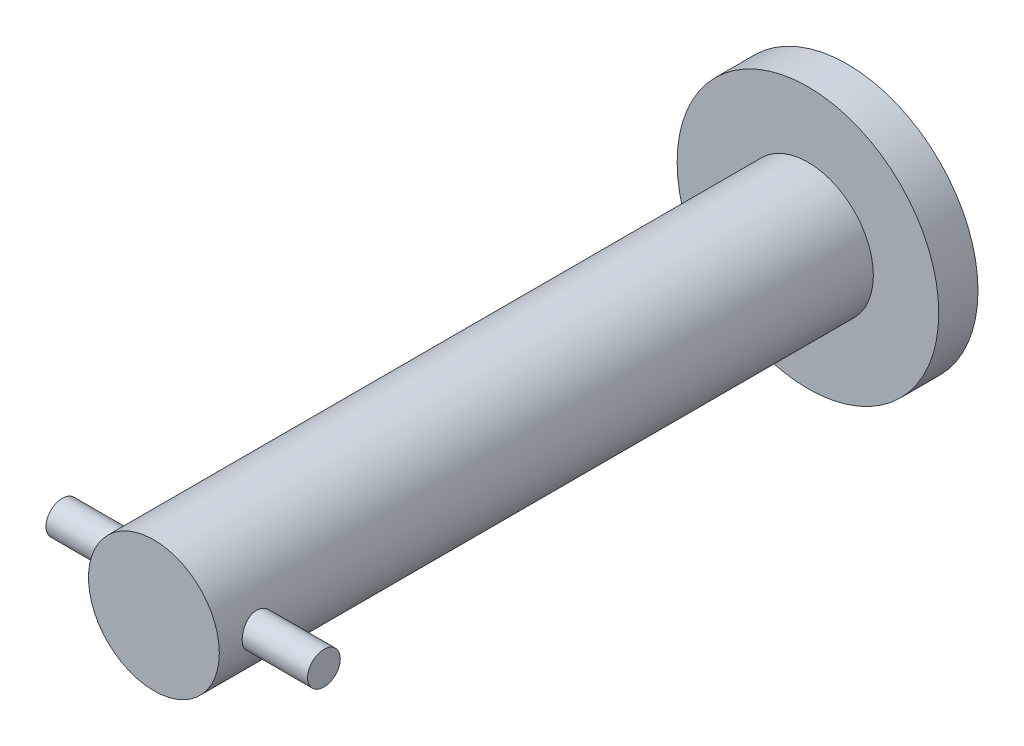
ISO-10303-21;
HEADER;
FILE_DESCRIPTION(('STEP AP214'),'2;1');
FILE_NAME('part.step','',(''),(''),'','','');
FILE_SCHEMA(('AUTOMOTIVE_DESIGN { 1 0 10303 214 1 1 1 1 }'));
ENDSEC;
DATA;
#1=APPLICATION_CONTEXT('core data for automotive mechanical design processes');
#2=APPLICATION_PROTOCOL_DEFINITION('international standard','automotive_design',2000,#1);
#3=PRODUCT_CONTEXT('',#1,'mechanical');
#4=PRODUCT('Part','Part','',(#3));
#5=PRODUCT_RELATED_PRODUCT_CATEGORY('part','',(#4));
#6=PRODUCT_DEFINITION_FORMATION('','',#4);
#7=PRODUCT_DEFINITION_CONTEXT('part definition',#1,'design');
#8=PRODUCT_DEFINITION('design','',#6,#7);
#9=PRODUCT_DEFINITION_SHAPE('','',#8);
#10=(LENGTH_UNIT() NAMED_UNIT(*) SI_UNIT(.MILLI.,.METRE.));
#11=(NAMED_UNIT(*) PLANE_ANGLE_UNIT() SI_UNIT($,.RADIAN.));
#12=(NAMED_UNIT(*) SI_UNIT($,.STERADIAN.) SOLID_ANGLE_UNIT());
#13=UNCERTAINTY_MEASURE_WITH_UNIT(LENGTH_MEASURE(1.E-05),#10,'distance_accuracy_value','');
#14=(GEOMETRIC_REPRESENTATION_CONTEXT(3) GLOBAL_UNCERTAINTY_ASSIGNED_CONTEXT((#13)) GLOBAL_UNIT_ASSIGNED_CONTEXT((#10,
#11,#12)) REPRESENTATION_CONTEXT('',''));
#15=CARTESIAN_POINT('',(0.,0.,0.));
#16=DIRECTION('',(0.,0.,1.));
#17=DIRECTION('',(1.,0.,0.));
#18=AXIS2_PLACEMENT_3D('',#15,#16,#17);
#19=CARTESIAN_POINT('',(0.,0.,5.));
#20=DIRECTION('',(0.,0.,1.));
#21=DIRECTION('',(1.,0.,0.));
#22=AXIS2_PLACEMENT_3D('',#19,#20,#21);
#23=PLANE('',#22);
#24=CARTESIAN_POINT('',(0.,0.,5.));
#25=DIRECTION('',(0.,0.,1.));
#26=DIRECTION('',(1.,0.,0.));
#27=AXIS2_PLACEMENT_3D('',#24,#25,#26);
#28=CIRCLE('',#27,10.);
#29=CARTESIAN_POINT('',(10.,0.,5.));
#30=VERTEX_POINT('',#29);
#31=EDGE_CURVE('E56',#30,#30,#28,.T.);
#32=ORIENTED_EDGE('',*,*,#31,.T.);
#33=EDGE_LOOP('',(#32));
#34=FACE_BOUND('',#33,.T.);
#35=CARTESIAN_POINT('',(0.,0.,5.));
#36=DIRECTION('',(0.,0.,1.));
#37=DIRECTION('',(1.,0.,0.));
#38=AXIS2_PLACEMENT_3D('',#35,#36,#37);
#39=CIRCLE('',#38,5.);
#40=CARTESIAN_POINT('',(5.,0.,5.));
#41=VERTEX_POINT('',#40);
#42=EDGE_CURVE('E108',#41,#41,#39,.T.);
#43=ORIENTED_EDGE('',*,*,#42,.F.);
#44=EDGE_LOOP('',(#43));
#45=FACE_BOUND('',#44,.T.);
#46=ADVANCED_FACE('F37',(#34,#45),#23,.T.);
#47=CARTESIAN_POINT('',(0.,0.,0.));
#48=DIRECTION('',(0.,0.,1.));
#49=DIRECTION('',(1.,0.,0.));
#50=AXIS2_PLACEMENT_3D('',#47,#48,#49);
#51=PLANE('',#50);
#52=CARTESIAN_POINT('',(0.,0.,0.));
#53=DIRECTION('',(0.,0.,1.));
#54=DIRECTION('',(1.,0.,0.));
#55=AXIS2_PLACEMENT_3D('',#52,#53,#54);
#56=CIRCLE('',#55,6.99999999999999);
#57=CARTESIAN_POINT('',(6.99999999999999,0.,0.));
#58=VERTEX_POINT('',#57);
#59=EDGE_CURVE('E10',#58,#58,#56,.F.);
#60=ORIENTED_EDGE('',*,*,#59,.T.);
#61=EDGE_LOOP('',(#60));
#62=FACE_BOUND('',#61,.T.);
#63=ADVANCED_FACE('F92',(#62),#51,.F.);
#64=CARTESIAN_POINT('',(0.,0.,5.));
#65=DIRECTION('',(0.,0.,-1.));
#66=DIRECTION('',(-1.,0.,0.));
#67=AXIS2_PLACEMENT_3D('',#64,#65,#66);
#68=CYLINDRICAL_SURFACE('',#67,10.);
#69=CARTESIAN_POINT('',(0.,0.,2.00000000000001));
#70=DIRECTION('',(0.,0.,1.));
#71=DIRECTION('',(1.,0.,0.));
#72=AXIS2_PLACEMENT_3D('',#69,#70,#71);
#73=CIRCLE('',#72,10.);
#74=CARTESIAN_POINT('',(10.,0.,2.00000000000001));
#75=VERTEX_POINT('',#74);
#76=EDGE_CURVE('E53',#75,#75,#73,.T.);
#77=ORIENTED_EDGE('',*,*,#76,.T.);
#78=EDGE_LOOP('',(#77));
#79=FACE_BOUND('',#78,.T.);
#80=ORIENTED_EDGE('',*,*,#31,.F.);
#81=EDGE_LOOP('',(#80));
#82=FACE_BOUND('',#81,.T.);
#83=ADVANCED_FACE('F95',(#79,#82),#68,.T.);
#84=CARTESIAN_POINT('',(0.,0.,55.));
#85=DIRECTION('',(0.,0.,-1.));
#86=DIRECTION('',(-1.,0.,0.));
#87=AXIS2_PLACEMENT_3D('',#84,#85,#86);
#88=CYLINDRICAL_SURFACE('',#87,5.);
#89=CARTESIAN_POINT('',(-5.,0.,53.25));
#90=CARTESIAN_POINT('',(-4.99999883223344,-0.0690634072247758,53.2499980618849));
#91=CARTESIAN_POINT('',(-4.99855481776523,-0.138148464858969,53.2442570410218));
#92=CARTESIAN_POINT('',(-4.99293428191577,-0.27433860314211,53.2214790405775));
#93=CARTESIAN_POINT('',(-4.98875621183307,-0.341442539058949,53.2044356587185));
#94=CARTESIAN_POINT('',(-4.97813021943366,-0.471684060152147,53.1596339554483));
#95=CARTESIAN_POINT('',(-4.97168502368406,-0.534826302858336,53.1318885010706));
#96=CARTESIAN_POINT('',(-4.95721119839661,-0.655560109920356,53.066515508296));
#97=CARTESIAN_POINT('',(-4.94918251545042,-0.7131514869573,53.0288876365676));
#98=CARTESIAN_POINT('',(-4.93222844659834,-0.822334939417434,52.9439993419548));
#99=CARTESIAN_POINT('',(-4.92328922623777,-0.873796408384228,52.896573687534));
#100=CARTESIAN_POINT('',(-4.90561350097941,-0.968124106002755,52.7937898292426));
#101=CARTESIAN_POINT('',(-4.89687701906957,-1.01098936412428,52.7384307308779));
#102=CARTESIAN_POINT('',(-4.88045646416425,-1.08752211899919,52.6203373110521));
#103=CARTESIAN_POINT('',(-4.87278995392171,-1.12104351327113,52.5575056409913));
#104=CARTESIAN_POINT('',(-4.85957912343519,-1.17699742379211,52.426876323618));
#105=CARTESIAN_POINT('',(-4.8540344639399,-1.19943171286611,52.3590794722285));
#106=CARTESIAN_POINT('',(-4.84583730597959,-1.23212903067024,52.2218804181646));
#107=CARTESIAN_POINT('',(-4.84312909229521,-1.24262689027779,52.1525375866252));
#108=CARTESIAN_POINT('',(-4.8407446878145,-1.25188481255655,52.0130261924884));
#109=CARTESIAN_POINT('',(-4.8410680037387,-1.25064678484832,51.9428577660845));
#110=CARTESIAN_POINT('',(-4.84466004580515,-1.23665543719941,51.8054868268796));
#111=CARTESIAN_POINT('',(-4.84785719168232,-1.22418195015877,51.7382536487791));
#112=CARTESIAN_POINT('',(-4.85672258063736,-1.1885201557526,51.6068657909073));
#113=CARTESIAN_POINT('',(-4.8623909997558,-1.16533108505786,51.5427113308092));
#114=CARTESIAN_POINT('',(-4.87562594920155,-1.10865789828097,51.4185516531233));
#115=CARTESIAN_POINT('',(-4.88321106224517,-1.0750722226941,51.358594856842));
#116=CARTESIAN_POINT('',(-4.89941425705321,-0.998630230012472,51.2450677418693));
#117=CARTESIAN_POINT('',(-4.90803251945612,-0.955772290674044,51.1914985432773));
#118=CARTESIAN_POINT('',(-4.92563233783151,-0.860552853901028,51.090663653588));
#119=CARTESIAN_POINT('',(-4.93461724564976,-0.80795521513823,51.0436212582822));
#120=CARTESIAN_POINT('',(-4.95171637982321,-0.695509931253097,50.9589822979467));
#121=CARTESIAN_POINT('',(-4.95983057957846,-0.635662064756634,50.921386021447));
#122=CARTESIAN_POINT('',(-4.97431443411818,-0.510096573901175,50.8566245114797));
#123=CARTESIAN_POINT('',(-4.98067800106437,-0.444359494340535,50.829495549788));
#124=CARTESIAN_POINT('',(-4.99089930826182,-0.309063340119084,50.7867355785754));
#125=CARTESIAN_POINT('',(-4.99475752782734,-0.239504999292086,50.7711023696516));
#126=CARTESIAN_POINT('',(-4.99946249392812,-0.100449975325038,50.7521186953676));
#127=CARTESIAN_POINT('',(-5.00038377923565,-0.0309972666568571,50.7484641449373));
#128=CARTESIAN_POINT('',(-4.99932337345376,0.107527395667908,50.7527075017129));
#129=CARTESIAN_POINT('',(-4.99734194368205,0.176599383037147,50.7606043689993));
#130=CARTESIAN_POINT('',(-4.99074650939464,0.311345223980395,50.7874757569928));
#131=CARTESIAN_POINT('',(-4.98617195154843,0.377054265807281,50.8062843862308));
#132=CARTESIAN_POINT('',(-4.97490588861778,0.504381077043745,50.854255903357));
#133=CARTESIAN_POINT('',(-4.9682141697491,0.56599843252718,50.8834198369276));
#134=CARTESIAN_POINT('',(-4.95327756605259,0.684602612024857,50.9518634407289));
#135=CARTESIAN_POINT('',(-4.94500722805777,0.74148786819651,50.9913134269973));
#136=CARTESIAN_POINT('',(-4.92787090989516,0.847938844702688,51.0789915906641));
#137=CARTESIAN_POINT('',(-4.91900482709754,0.897503299144155,51.1272212830141));
#138=CARTESIAN_POINT('',(-4.9014079746731,0.989158806727259,51.232501634037));
#139=CARTESIAN_POINT('',(-4.89268586822734,1.03103655635168,51.289739752502));
#140=CARTESIAN_POINT('',(-4.87660731981032,1.10459229917723,51.4106105287214));
#141=CARTESIAN_POINT('',(-4.86925081722522,1.1362707451316,51.4742429024665));
#142=CARTESIAN_POINT('',(-4.85681745612221,1.18829285050773,51.6057547686776));
#143=CARTESIAN_POINT('',(-4.85172712743255,1.20870366387837,51.6736063569533));
#144=CARTESIAN_POINT('',(-4.84438953408486,1.23778804996147,51.8119246982409));
#145=CARTESIAN_POINT('',(-4.84214164766614,1.24646418956554,51.8823908758604));
#146=CARTESIAN_POINT('',(-4.84079084336631,1.25169882527832,52.0217675198793));
#147=CARTESIAN_POINT('',(-4.8415994394022,1.24859824815009,52.0906645292706));
#148=CARTESIAN_POINT('',(-4.84606590839869,1.23114773192738,52.2269199072233));
#149=CARTESIAN_POINT('',(-4.84972372409881,1.21679801890563,52.294278306678));
#150=CARTESIAN_POINT('',(-4.85942717235602,1.17744276620232,52.4251737158878));
#151=CARTESIAN_POINT('',(-4.86545846030258,1.15250117056697,52.4887310877002));
#152=CARTESIAN_POINT('',(-4.87923129770691,1.09272076133755,52.6108044855947));
#153=CARTESIAN_POINT('',(-4.88697308433978,1.05788057502848,52.6693198109891));
#154=CARTESIAN_POINT('',(-4.90354695219593,0.978223123864275,52.7812955241683));
#155=CARTESIAN_POINT('',(-4.91240220693131,0.933169302426872,52.8345842278533));
#156=CARTESIAN_POINT('',(-4.93006689371905,0.83482447599144,52.9329558706628));
#157=CARTESIAN_POINT('',(-4.93887631439216,0.781531517717616,52.9780368584275));
#158=CARTESIAN_POINT('',(-4.95564713039719,0.667056322252154,53.0595094238038));
#159=CARTESIAN_POINT('',(-4.9635902780489,0.605748685263651,53.0957288447263));
#160=CARTESIAN_POINT('',(-4.97754104145932,0.477721716258728,53.1572895524504));
#161=CARTESIAN_POINT('',(-4.98355004333151,0.411006302863949,53.1826386338738));
#162=CARTESIAN_POINT('',(-4.99206716304618,0.28700854436956,53.2179765252747));
#163=CARTESIAN_POINT('',(-4.99502154210575,0.230316809090057,53.2299593692112));
#164=CARTESIAN_POINT('',(-4.9989883769329,0.115755059613569,53.2459716196849));
#165=CARTESIAN_POINT('',(-5.00000097875745,0.0578851343688469,53.2500016244211));
#166=CARTESIAN_POINT('',(-5.,0.,53.25));
#167=B_SPLINE_CURVE_WITH_KNOTS('',3,(#89,#90,#91,#92,#93,#94,#95,#96,#97,#98,#99,#100,#101,#102,
#103,#104,#105,#106,#107,#108,#109,#110,#111,#112,#113,#114,#115,#116,#117,#118,#119,#120,#121,
#122,#123,#124,#125,#126,#127,#128,#129,#130,#131,#132,#133,#134,#135,#136,#137,#138,#139,#140,
#141,#142,#143,#144,#145,#146,#147,#148,#149,#150,#151,#152,#153,#154,#155,#156,#157,#158,#159,
#160,#161,#162,#163,#164,#165,#166),.UNSPECIFIED.,.T.,.F.,(4,2,2,2,2,2,2,2,2,2,2,2,2,2,2,2,2,2,
2,2,2,2,2,2,2,2,2,2,2,2,2,2,2,2,2,2,2,2,4),(0.,0.206978093726575,0.414073531469914,
0.620920751905089,0.827774950141104,1.03845362864283,1.24915607983385,1.46298872954838,
1.67678717641139,1.88630245916191,2.09578365093913,2.30018747505847,2.50460586221698,
2.71108773228232,2.91760575696801,3.13001250807515,3.34242574631871,3.55556857507594,
3.76867061407201,3.97631924124396,4.18394917593951,4.38850228761697,4.59307606101907,
4.80127989637792,5.00951969173347,5.22287091003728,5.43621265624588,5.64826878845028,
5.86027852710338,6.06619816998843,6.2721136746336,6.47680333799538,6.68152140114082,
6.8915798034159,7.10168808142013,7.31560154582987,7.52936136517789,7.70285202451788,
7.87632963369197),.UNSPECIFIED.);
#168=CARTESIAN_POINT('',(-5.,0.,53.25));
#169=VERTEX_POINT('',#168);
#170=EDGE_CURVE('E44',#169,#169,#167,.T.);
#171=ORIENTED_EDGE('',*,*,#170,.T.);
#172=EDGE_LOOP('',(#171));
#173=FACE_BOUND('',#172,.T.);
#174=CARTESIAN_POINT('',(5.,0.,50.75));
#175=CARTESIAN_POINT('',(4.99999883223344,-0.0690634072247831,50.7500019381151));
#176=CARTESIAN_POINT('',(4.99855481776523,-0.138148464858976,50.7557429589782));
#177=CARTESIAN_POINT('',(4.99293428191577,-0.274338603142117,50.7785209594225));
#178=CARTESIAN_POINT('',(4.98875621183307,-0.341442539058956,50.7955643412815));
#179=CARTESIAN_POINT('',(4.97813021943366,-0.471684060152155,50.8403660445517));
#180=CARTESIAN_POINT('',(4.97168502368405,-0.534826302858343,50.8681114989294));
#181=CARTESIAN_POINT('',(4.95721119839661,-0.655560109920362,50.933484491704));
#182=CARTESIAN_POINT('',(4.94918251545042,-0.713151486957304,50.9711123634324));
#183=CARTESIAN_POINT('',(4.93222844659834,-0.822334939417438,51.0560006580452));
#184=CARTESIAN_POINT('',(4.92328922623777,-0.873796408384232,51.103426312466));
#185=CARTESIAN_POINT('',(4.90561350097941,-0.968124106002759,51.2062101707574));
#186=CARTESIAN_POINT('',(4.89687701906957,-1.01098936412428,51.2615692691221));
#187=CARTESIAN_POINT('',(4.88045646416425,-1.0875221189992,51.3796626889479));
#188=CARTESIAN_POINT('',(4.87278995392171,-1.12104351327113,51.4424943590087));
#189=CARTESIAN_POINT('',(4.85957912343519,-1.17699742379211,51.573123676382));
#190=CARTESIAN_POINT('',(4.8540344639399,-1.19943171286611,51.6409205277715));
#191=CARTESIAN_POINT('',(4.84583730597959,-1.23212903067025,51.7781195818354));
#192=CARTESIAN_POINT('',(4.84312909229521,-1.24262689027779,51.8474624133748));
#193=CARTESIAN_POINT('',(4.8407446878145,-1.25188481255655,51.9869738075116));
#194=CARTESIAN_POINT('',(4.8410680037387,-1.25064678484832,52.0571422339155));
#195=CARTESIAN_POINT('',(4.84466004580515,-1.23665543719941,52.1945131731204));
#196=CARTESIAN_POINT('',(4.84785719168233,-1.22418195015877,52.2617463512209));
#197=CARTESIAN_POINT('',(4.85672258063736,-1.18852015575259,52.3931342090927));
#198=CARTESIAN_POINT('',(4.8623909997558,-1.16533108505786,52.4572886691908));
#199=CARTESIAN_POINT('',(4.87562594920155,-1.10865789828096,52.5814483468767));
#200=CARTESIAN_POINT('',(4.88321106224517,-1.0750722226941,52.641405143158));
#201=CARTESIAN_POINT('',(4.89941425705321,-0.998630230012469,52.7549322581307));
#202=CARTESIAN_POINT('',(4.90803251945612,-0.95577229067404,52.8085014567227));
#203=CARTESIAN_POINT('',(4.92563233783151,-0.860552853901023,52.909336346412));
#204=CARTESIAN_POINT('',(4.93461724564976,-0.807955215138226,52.9563787417178));
#205=CARTESIAN_POINT('',(4.95171637982321,-0.695509931253092,53.0410177020532));
#206=CARTESIAN_POINT('',(4.95983057957846,-0.635662064756626,53.078613978553));
#207=CARTESIAN_POINT('',(4.97431443411819,-0.510096573901164,53.1433754885203));
#208=CARTESIAN_POINT('',(4.98067800106437,-0.444359494340524,53.170504450212));
#209=CARTESIAN_POINT('',(4.99089930826182,-0.309063340119074,53.2132644214246));
#210=CARTESIAN_POINT('',(4.99475752782734,-0.239504999292076,53.2288976303484));
#211=CARTESIAN_POINT('',(4.99946249392812,-0.100449975325028,53.2478813046324));
#212=CARTESIAN_POINT('',(5.00038377923565,-0.030997266656848,53.2515358550627));
#213=CARTESIAN_POINT('',(4.99932337345376,0.107527395667916,53.2472924982871));
#214=CARTESIAN_POINT('',(4.99734194368205,0.176599383037155,53.2393956310007));
#215=CARTESIAN_POINT('',(4.99074650939464,0.311345223980401,53.2125242430072));
#216=CARTESIAN_POINT('',(4.98617195154843,0.377054265807286,53.1937156137692));
#217=CARTESIAN_POINT('',(4.97490588861778,0.50438107704375,53.145744096643));
#218=CARTESIAN_POINT('',(4.9682141697491,0.565998432527187,53.1165801630724));
#219=CARTESIAN_POINT('',(4.95327756605259,0.684602612024865,53.0481365592711));
#220=CARTESIAN_POINT('',(4.94500722805777,0.741487868196517,53.0086865730027));
#221=CARTESIAN_POINT('',(4.92787090989516,0.847938844702695,52.9210084093358));
#222=CARTESIAN_POINT('',(4.91900482709754,0.897503299144162,52.8727787169859));
#223=CARTESIAN_POINT('',(4.90140797467309,0.989158806727264,52.7674983659629));
#224=CARTESIAN_POINT('',(4.89268586822734,1.03103655635168,52.710260247498));
#225=CARTESIAN_POINT('',(4.87660731981032,1.10459229917724,52.5893894712786));
#226=CARTESIAN_POINT('',(4.86925081722522,1.1362707451316,52.5257570975335));
#227=CARTESIAN_POINT('',(4.85681745612221,1.18829285050773,52.3942452313224));
#228=CARTESIAN_POINT('',(4.85172712743255,1.20870366387838,52.3263936430467));
#229=CARTESIAN_POINT('',(4.84438953408486,1.23778804996147,52.1880753017591));
#230=CARTESIAN_POINT('',(4.84214164766614,1.24646418956554,52.1176091241396));
#231=CARTESIAN_POINT('',(4.84079084336631,1.25169882527832,51.9782324801207));
#232=CARTESIAN_POINT('',(4.8415994394022,1.24859824815009,51.9093354707294));
#233=CARTESIAN_POINT('',(4.84606590839869,1.23114773192738,51.7730800927767));
#234=CARTESIAN_POINT('',(4.84972372409881,1.21679801890563,51.705721693322));
#235=CARTESIAN_POINT('',(4.85942717235602,1.17744276620232,51.5748262841122));
#236=CARTESIAN_POINT('',(4.86545846030258,1.15250117056697,51.5112689122998));
#237=CARTESIAN_POINT('',(4.87923129770691,1.09272076133755,51.3891955144053));
#238=CARTESIAN_POINT('',(4.88697308433978,1.05788057502848,51.3306801890109));
#239=CARTESIAN_POINT('',(4.90354695219593,0.97822312386427,51.2187044758317));
#240=CARTESIAN_POINT('',(4.91240220693131,0.933169302426869,51.1654157721467));
#241=CARTESIAN_POINT('',(4.93006689371905,0.834824475991438,51.0670441293372));
#242=CARTESIAN_POINT('',(4.93887631439216,0.781531517717614,51.0219631415725));
#243=CARTESIAN_POINT('',(4.95564713039719,0.667056322252151,50.9404905761962));
#244=CARTESIAN_POINT('',(4.9635902780489,0.605748685263647,50.9042711552737));
#245=CARTESIAN_POINT('',(4.97754104145932,0.477721716258722,50.8427104475496));
#246=CARTESIAN_POINT('',(4.98355004333151,0.411006302863942,50.8173613661262));
#247=CARTESIAN_POINT('',(4.99206716304618,0.287008544369553,50.7820234747253));
#248=CARTESIAN_POINT('',(4.99502154210576,0.23031680909005,50.7700406307888));
#249=CARTESIAN_POINT('',(4.9989883769329,0.115755059613562,50.754028380315));
#250=CARTESIAN_POINT('',(5.00000097875745,0.0578851343688397,50.7499983755789));
#251=CARTESIAN_POINT('',(5.,0.,50.75));
#252=B_SPLINE_CURVE_WITH_KNOTS('',3,(#174,#175,#176,#177,#178,#179,#180,#181,#182,#183,#184,
#185,#186,#187,#188,#189,#190,#191,#192,#193,#194,#195,#196,#197,#198,#199,#200,#201,#202,#203,
#204,#205,#206,#207,#208,#209,#210,#211,#212,#213,#214,#215,#216,#217,#218,#219,#220,#221,#222,
#223,#224,#225,#226,#227,#228,#229,#230,#231,#232,#233,#234,#235,#236,#237,#238,#239,#240,#241,
#242,#243,#244,#245,#246,#247,#248,#249,#250,#251),.UNSPECIFIED.,.T.,.F.,(4,2,2,2,2,2,2,2,2,2,2,
2,2,2,2,2,2,2,2,2,2,2,2,2,2,2,2,2,2,2,2,2,2,2,2,2,2,2,4),(0.,0.206978093726574,
0.414073531469915,0.620920751905087,0.827774950141106,1.03845362864282,1.24915607983385,
1.46298872954839,1.6767871764114,1.8863024591619,2.09578365093913,2.30018747505847,
2.50460586221699,2.71108773228231,2.91760575696801,3.13001250807515,3.34242574631872,
3.55556857507594,3.76867061407201,3.97631924124396,4.18394917593951,4.38850228761696,
4.59307606101907,4.80127989637792,5.00951969173348,5.22287091003728,5.43621265624588,
5.64826878845029,5.86027852710339,6.06619816998841,6.2721136746336,6.47680333799538,
6.68152140114083,6.89157980341589,7.10168808142012,7.31560154582988,7.52936136517789,
7.70285202451788,7.87632963369197),.UNSPECIFIED.);
#253=CARTESIAN_POINT('',(5.,0.,50.75));
#254=VERTEX_POINT('',#253);
#255=EDGE_CURVE('E64',#254,#254,#252,.T.);
#256=ORIENTED_EDGE('',*,*,#255,.T.);
#257=EDGE_LOOP('',(#256));
#258=FACE_BOUND('',#257,.T.);
#259=ORIENTED_EDGE('',*,*,#42,.T.);
#260=EDGE_LOOP('',(#259));
#261=FACE_BOUND('',#260,.T.);
#262=CARTESIAN_POINT('',(0.,0.,55.));
#263=DIRECTION('',(0.,0.,1.));
#264=DIRECTION('',(1.,0.,0.));
#265=AXIS2_PLACEMENT_3D('',#262,#263,#264);
#266=CIRCLE('',#265,5.);
#267=CARTESIAN_POINT('',(5.,0.,55.));
#268=VERTEX_POINT('',#267);
#269=EDGE_CURVE('E112',#268,#268,#266,.T.);
#270=ORIENTED_EDGE('',*,*,#269,.F.);
#271=EDGE_LOOP('',(#270));
#272=FACE_BOUND('',#271,.T.);
#273=ADVANCED_FACE('F69',(#173,#258,#261,#272),#88,.T.);
#274=CARTESIAN_POINT('',(0.,0.,55.));
#275=DIRECTION('',(0.,0.,1.));
#276=DIRECTION('',(1.,0.,0.));
#277=AXIS2_PLACEMENT_3D('',#274,#275,#276);
#278=PLANE('',#277);
#279=ORIENTED_EDGE('',*,*,#269,.T.);
#280=EDGE_LOOP('',(#279));
#281=FACE_BOUND('',#280,.T.);
#282=ADVANCED_FACE('F79',(#281),#278,.T.);
#283=CARTESIAN_POINT('',(0.,0.,2.00000000000001));
#284=DIRECTION('',(0.,0.,1.));
#285=DIRECTION('',(1.,0.,0.));
#286=AXIS2_PLACEMENT_3D('',#283,#284,#285);
#287=CONICAL_SURFACE('',#286,10.,0.98279372324733);
#288=ORIENTED_EDGE('',*,*,#59,.F.);
#289=EDGE_LOOP('',(#288));
#290=FACE_BOUND('',#289,.T.);
#291=ORIENTED_EDGE('',*,*,#76,.F.);
#292=EDGE_LOOP('',(#291));
#293=FACE_BOUND('',#292,.T.);
#294=ADVANCED_FACE('F43',(#290,#293),#287,.T.);
#295=CARTESIAN_POINT('',(10.,0.,52.));
#296=DIRECTION('',(1.,0.,0.));
#297=DIRECTION('',(0.,0.,-1.));
#298=AXIS2_PLACEMENT_3D('',#295,#296,#297);
#299=PLANE('',#298);
#300=CARTESIAN_POINT('',(10.,0.,52.));
#301=DIRECTION('',(1.,0.,0.));
#302=DIRECTION('',(0.,0.,-1.));
#303=AXIS2_PLACEMENT_3D('',#300,#301,#302);
#304=CIRCLE('',#303,1.25);
#305=CARTESIAN_POINT('',(10.,0.,50.75));
#306=VERTEX_POINT('',#305);
#307=EDGE_CURVE('E119',#306,#306,#304,.T.);
#308=ORIENTED_EDGE('',*,*,#307,.T.);
#309=EDGE_LOOP('',(#308));
#310=FACE_BOUND('',#309,.T.);
#311=ADVANCED_FACE('F90',(#310),#299,.T.);
#312=CARTESIAN_POINT('',(-10.,0.,52.));
#313=DIRECTION('',(1.,0.,0.));
#314=DIRECTION('',(0.,0.,-1.));
#315=AXIS2_PLACEMENT_3D('',#312,#313,#314);
#316=CYLINDRICAL_SURFACE('',#315,1.25);
#317=ORIENTED_EDGE('',*,*,#307,.F.);
#318=EDGE_LOOP('',(#317));
#319=FACE_BOUND('',#318,.T.);
#320=ORIENTED_EDGE('',*,*,#255,.F.);
#321=EDGE_LOOP('',(#320));
#322=FACE_BOUND('',#321,.T.);
#323=ADVANCED_FACE('F80',(#319,#322),#316,.T.);
#324=CARTESIAN_POINT('',(-10.,0.,52.));
#325=DIRECTION('',(1.,0.,0.));
#326=DIRECTION('',(0.,0.,-1.));
#327=AXIS2_PLACEMENT_3D('',#324,#325,#326);
#328=CIRCLE('',#327,1.25);
#329=CARTESIAN_POINT('',(-10.,0.,50.75));
#330=VERTEX_POINT('',#329);
#331=EDGE_CURVE('E70',#330,#330,#328,.T.);
#332=ORIENTED_EDGE('',*,*,#331,.T.);
#333=EDGE_LOOP('',(#332));
#334=FACE_BOUND('',#333,.T.);
#335=ORIENTED_EDGE('',*,*,#170,.F.);
#336=EDGE_LOOP('',(#335));
#337=FACE_BOUND('',#336,.T.);
#338=ADVANCED_FACE('F75',(#334,#337),#316,.T.);
#339=CARTESIAN_POINT('',(-10.,0.,52.));
#340=DIRECTION('',(1.,0.,0.));
#341=DIRECTION('',(0.,0.,-1.));
#342=AXIS2_PLACEMENT_3D('',#339,#340,#341);
#343=PLANE('',#342);
#344=ORIENTED_EDGE('',*,*,#331,.F.);
#345=EDGE_LOOP('',(#344));
#346=FACE_BOUND('',#345,.T.);
#347=ADVANCED_FACE('F76',(#346),#343,.F.);
#348=CLOSED_SHELL('',(#46,#63,#83,#273,#282,#294,#311,#323,#338,#347));
#349=MANIFOLD_SOLID_BREP('B2',#348);
#350=ADVANCED_BREP_SHAPE_REPRESENTATION('',(#18,#349),#14);
#351=SHAPE_DEFINITION_REPRESENTATION(#9,#350);
ENDSEC;
END-ISO-10303-21;
